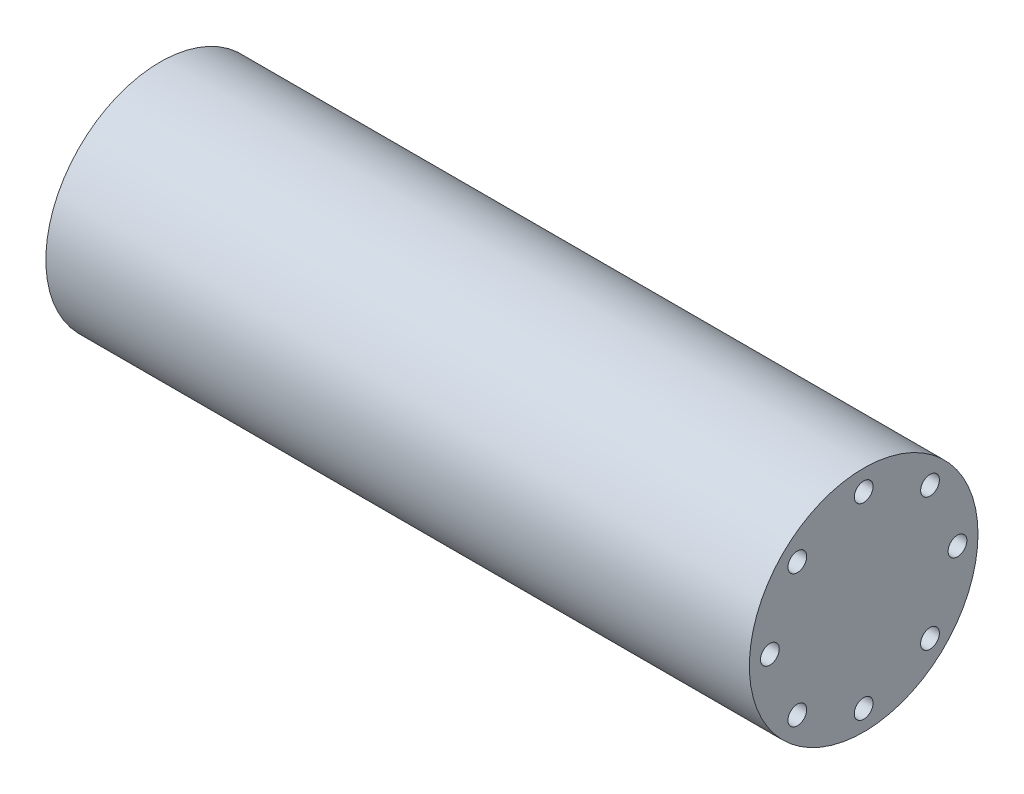
ISO-10303-21;
HEADER;
FILE_DESCRIPTION(('STEP AP214'),'2;1');
FILE_NAME('part.step','',(''),(''),'','','');
FILE_SCHEMA(('AUTOMOTIVE_DESIGN { 1 0 10303 214 1 1 1 1 }'));
ENDSEC;
DATA;
#1=APPLICATION_CONTEXT('core data for automotive mechanical design processes');
#2=APPLICATION_PROTOCOL_DEFINITION('international standard','automotive_design',2000,#1);
#3=PRODUCT_CONTEXT('',#1,'mechanical');
#4=PRODUCT('Part','Part','',(#3));
#5=PRODUCT_RELATED_PRODUCT_CATEGORY('part','',(#4));
#6=PRODUCT_DEFINITION_FORMATION('','',#4);
#7=PRODUCT_DEFINITION_CONTEXT('part definition',#1,'design');
#8=PRODUCT_DEFINITION('design','',#6,#7);
#9=PRODUCT_DEFINITION_SHAPE('','',#8);
#10=(LENGTH_UNIT() NAMED_UNIT(*) SI_UNIT(.MILLI.,.METRE.));
#11=(NAMED_UNIT(*) PLANE_ANGLE_UNIT() SI_UNIT($,.RADIAN.));
#12=(NAMED_UNIT(*) SI_UNIT($,.STERADIAN.) SOLID_ANGLE_UNIT());
#13=UNCERTAINTY_MEASURE_WITH_UNIT(LENGTH_MEASURE(1.E-05),#10,'distance_accuracy_value','');
#14=(GEOMETRIC_REPRESENTATION_CONTEXT(3) GLOBAL_UNCERTAINTY_ASSIGNED_CONTEXT((#13)) GLOBAL_UNIT_ASSIGNED_CONTEXT((#10,
#11,#12)) REPRESENTATION_CONTEXT('',''));
#15=CARTESIAN_POINT('',(0.,0.,0.));
#16=DIRECTION('',(0.,0.,1.));
#17=DIRECTION('',(1.,0.,0.));
#18=AXIS2_PLACEMENT_3D('',#15,#16,#17);
#19=CARTESIAN_POINT('',(60.,0.,0.));
#20=DIRECTION('',(-1.,0.,0.));
#21=DIRECTION('',(0.,0.,1.));
#22=AXIS2_PLACEMENT_3D('',#19,#20,#21);
#23=CYLINDRICAL_SURFACE('',#22,9.75);
#24=CARTESIAN_POINT('',(60.,0.,0.));
#25=DIRECTION('',(1.,0.,0.));
#26=DIRECTION('',(0.,0.,-1.));
#27=AXIS2_PLACEMENT_3D('',#24,#25,#26);
#28=CIRCLE('',#27,9.75);
#29=CARTESIAN_POINT('',(60.,0.,-9.75));
#30=VERTEX_POINT('',#29);
#31=EDGE_CURVE('E11',#30,#30,#28,.T.);
#32=ORIENTED_EDGE('',*,*,#31,.F.);
#33=EDGE_LOOP('',(#32));
#34=FACE_BOUND('',#33,.T.);
#35=CARTESIAN_POINT('',(0.,0.,0.));
#36=DIRECTION('',(1.,0.,0.));
#37=DIRECTION('',(0.,0.,-1.));
#38=AXIS2_PLACEMENT_3D('',#35,#36,#37);
#39=CIRCLE('',#38,9.75);
#40=CARTESIAN_POINT('',(0.,0.,-9.75));
#41=VERTEX_POINT('',#40);
#42=EDGE_CURVE('E48',#41,#41,#39,.T.);
#43=ORIENTED_EDGE('',*,*,#42,.T.);
#44=EDGE_LOOP('',(#43));
#45=FACE_BOUND('',#44,.T.);
#46=ADVANCED_FACE('F45',(#34,#45),#23,.T.);
#47=CARTESIAN_POINT('',(60.,0.,0.));
#48=DIRECTION('',(1.,0.,0.));
#49=DIRECTION('',(0.,0.,-1.));
#50=AXIS2_PLACEMENT_3D('',#47,#48,#49);
#51=PLANE('',#50);
#52=CARTESIAN_POINT('',(60.,8.,0.));
#53=DIRECTION('',(1.,0.,0.));
#54=DIRECTION('',(0.,0.,-1.));
#55=AXIS2_PLACEMENT_3D('',#52,#53,#54);
#56=CIRCLE('',#55,0.8);
#57=CARTESIAN_POINT('',(60.,8.,-0.8));
#58=VERTEX_POINT('',#57);
#59=EDGE_CURVE('E175',#58,#58,#56,.T.);
#60=ORIENTED_EDGE('',*,*,#59,.F.);
#61=EDGE_LOOP('',(#60));
#62=FACE_BOUND('',#61,.T.);
#63=CARTESIAN_POINT('',(60.,5.65685424949262,-5.65685424949248));
#64=DIRECTION('',(1.,0.,0.));
#65=DIRECTION('',(0.,0.,-1.));
#66=AXIS2_PLACEMENT_3D('',#63,#64,#65);
#67=CIRCLE('',#66,0.799999999999999);
#68=CARTESIAN_POINT('',(60.,5.65685424949262,-6.45685424949248));
#69=VERTEX_POINT('',#68);
#70=EDGE_CURVE('E183',#69,#69,#67,.T.);
#71=ORIENTED_EDGE('',*,*,#70,.F.);
#72=EDGE_LOOP('',(#71));
#73=FACE_BOUND('',#72,.T.);
#74=CARTESIAN_POINT('',(60.,3.4008079572553E-13,-8.00000000000034));
#75=DIRECTION('',(1.,0.,0.));
#76=DIRECTION('',(0.,0.,-1.));
#77=AXIS2_PLACEMENT_3D('',#74,#75,#76);
#78=CIRCLE('',#77,0.8);
#79=CARTESIAN_POINT('',(60.,3.4008079572553E-13,-8.80000000000034));
#80=VERTEX_POINT('',#79);
#81=EDGE_CURVE('E191',#80,#80,#78,.T.);
#82=ORIENTED_EDGE('',*,*,#81,.F.);
#83=EDGE_LOOP('',(#82));
#84=FACE_BOUND('',#83,.T.);
#85=CARTESIAN_POINT('',(60.,-5.65685424949214,-5.65685424949296));
#86=DIRECTION('',(1.,0.,0.));
#87=DIRECTION('',(0.,0.,-1.));
#88=AXIS2_PLACEMENT_3D('',#85,#86,#87);
#89=CIRCLE('',#88,0.799999999999999);
#90=CARTESIAN_POINT('',(60.,-5.65685424949214,-6.45685424949296));
#91=VERTEX_POINT('',#90);
#92=EDGE_CURVE('E199',#91,#91,#89,.T.);
#93=ORIENTED_EDGE('',*,*,#92,.F.);
#94=EDGE_LOOP('',(#93));
#95=FACE_BOUND('',#94,.T.);
#96=CARTESIAN_POINT('',(60.,-8.,-6.8016159145106E-13));
#97=DIRECTION('',(1.,0.,0.));
#98=DIRECTION('',(0.,0.,-1.));
#99=AXIS2_PLACEMENT_3D('',#96,#97,#98);
#100=CIRCLE('',#99,0.799999999999999);
#101=CARTESIAN_POINT('',(60.,-8.,-0.80000000000068));
#102=VERTEX_POINT('',#101);
#103=EDGE_CURVE('E207',#102,#102,#100,.T.);
#104=ORIENTED_EDGE('',*,*,#103,.F.);
#105=EDGE_LOOP('',(#104));
#106=FACE_BOUND('',#105,.T.);
#107=CARTESIAN_POINT('',(60.,-5.65685424949262,5.6568542494918));
#108=DIRECTION('',(1.,0.,0.));
#109=DIRECTION('',(0.,0.,-1.));
#110=AXIS2_PLACEMENT_3D('',#107,#108,#109);
#111=CIRCLE('',#110,0.799999999999999);
#112=CARTESIAN_POINT('',(60.,-5.65685424949262,4.8568542494918));
#113=VERTEX_POINT('',#112);
#114=EDGE_CURVE('E215',#113,#113,#111,.T.);
#115=ORIENTED_EDGE('',*,*,#114,.F.);
#116=EDGE_LOOP('',(#115));
#117=FACE_BOUND('',#116,.T.);
#118=CARTESIAN_POINT('',(60.,-3.41060513164848E-13,7.99999999999966));
#119=DIRECTION('',(1.,0.,0.));
#120=DIRECTION('',(0.,0.,-1.));
#121=AXIS2_PLACEMENT_3D('',#118,#119,#120);
#122=CIRCLE('',#121,0.8);
#123=CARTESIAN_POINT('',(60.,-3.41060513164848E-13,7.19999999999966));
#124=VERTEX_POINT('',#123);
#125=EDGE_CURVE('E223',#124,#124,#122,.T.);
#126=ORIENTED_EDGE('',*,*,#125,.F.);
#127=EDGE_LOOP('',(#126));
#128=FACE_BOUND('',#127,.T.);
#129=CARTESIAN_POINT('',(60.,5.65685424949214,5.65685424949228));
#130=DIRECTION('',(1.,0.,0.));
#131=DIRECTION('',(0.,0.,-1.));
#132=AXIS2_PLACEMENT_3D('',#129,#130,#131);
#133=CIRCLE('',#132,0.799999999999999);
#134=CARTESIAN_POINT('',(60.,5.65685424949214,4.85685424949228));
#135=VERTEX_POINT('',#134);
#136=EDGE_CURVE('E231',#135,#135,#133,.T.);
#137=ORIENTED_EDGE('',*,*,#136,.F.);
#138=EDGE_LOOP('',(#137));
#139=FACE_BOUND('',#138,.T.);
#140=ORIENTED_EDGE('',*,*,#31,.T.);
#141=EDGE_LOOP('',(#140));
#142=FACE_BOUND('',#141,.T.);
#143=ADVANCED_FACE('F248',(#62,#73,#84,#95,#106,#117,#128,#139,#142),#51,.T.);
#144=CARTESIAN_POINT('',(0.,0.,0.));
#145=DIRECTION('',(1.,0.,0.));
#146=DIRECTION('',(0.,0.,-1.));
#147=AXIS2_PLACEMENT_3D('',#144,#145,#146);
#148=PLANE('',#147);
#149=CARTESIAN_POINT('',(0.,8.,0.));
#150=DIRECTION('',(-1.,0.,0.));
#151=DIRECTION('',(0.,0.,1.));
#152=AXIS2_PLACEMENT_3D('',#149,#150,#151);
#153=CIRCLE('',#152,0.8);
#154=CARTESIAN_POINT('',(0.,8.,0.8));
#155=VERTEX_POINT('',#154);
#156=EDGE_CURVE('E114',#155,#155,#153,.T.);
#157=ORIENTED_EDGE('',*,*,#156,.F.);
#158=EDGE_LOOP('',(#157));
#159=FACE_BOUND('',#158,.T.);
#160=CARTESIAN_POINT('',(0.,5.65685424949262,-5.65685424949248));
#161=DIRECTION('',(-1.,0.,0.));
#162=DIRECTION('',(0.,0.,1.));
#163=AXIS2_PLACEMENT_3D('',#160,#161,#162);
#164=CIRCLE('',#163,0.799999999999999);
#165=CARTESIAN_POINT('',(0.,5.65685424949262,-4.85685424949248));
#166=VERTEX_POINT('',#165);
#167=EDGE_CURVE('E113',#166,#166,#164,.T.);
#168=ORIENTED_EDGE('',*,*,#167,.F.);
#169=EDGE_LOOP('',(#168));
#170=FACE_BOUND('',#169,.T.);
#171=CARTESIAN_POINT('',(0.,3.4008079572553E-13,-8.00000000000034));
#172=DIRECTION('',(-1.,0.,0.));
#173=DIRECTION('',(0.,0.,1.));
#174=AXIS2_PLACEMENT_3D('',#171,#172,#173);
#175=CIRCLE('',#174,0.8);
#176=CARTESIAN_POINT('',(0.,3.4008079572553E-13,-7.20000000000034));
#177=VERTEX_POINT('',#176);
#178=EDGE_CURVE('E127',#177,#177,#175,.T.);
#179=ORIENTED_EDGE('',*,*,#178,.F.);
#180=EDGE_LOOP('',(#179));
#181=FACE_BOUND('',#180,.T.);
#182=CARTESIAN_POINT('',(0.,-5.65685424949214,-5.65685424949296));
#183=DIRECTION('',(-1.,0.,0.));
#184=DIRECTION('',(0.,0.,1.));
#185=AXIS2_PLACEMENT_3D('',#182,#183,#184);
#186=CIRCLE('',#185,0.799999999999999);
#187=CARTESIAN_POINT('',(0.,-5.65685424949214,-4.85685424949296));
#188=VERTEX_POINT('',#187);
#189=EDGE_CURVE('E135',#188,#188,#186,.T.);
#190=ORIENTED_EDGE('',*,*,#189,.F.);
#191=EDGE_LOOP('',(#190));
#192=FACE_BOUND('',#191,.T.);
#193=CARTESIAN_POINT('',(0.,-8.,-6.8016159145106E-13));
#194=DIRECTION('',(-1.,0.,0.));
#195=DIRECTION('',(0.,0.,1.));
#196=AXIS2_PLACEMENT_3D('',#193,#194,#195);
#197=CIRCLE('',#196,0.799999999999999);
#198=CARTESIAN_POINT('',(0.,-8.,0.799999999999319));
#199=VERTEX_POINT('',#198);
#200=EDGE_CURVE('E143',#199,#199,#197,.T.);
#201=ORIENTED_EDGE('',*,*,#200,.F.);
#202=EDGE_LOOP('',(#201));
#203=FACE_BOUND('',#202,.T.);
#204=CARTESIAN_POINT('',(0.,-5.65685424949262,5.6568542494918));
#205=DIRECTION('',(-1.,0.,0.));
#206=DIRECTION('',(0.,0.,1.));
#207=AXIS2_PLACEMENT_3D('',#204,#205,#206);
#208=CIRCLE('',#207,0.799999999999999);
#209=CARTESIAN_POINT('',(0.,-5.65685424949262,6.4568542494918));
#210=VERTEX_POINT('',#209);
#211=EDGE_CURVE('E151',#210,#210,#208,.T.);
#212=ORIENTED_EDGE('',*,*,#211,.F.);
#213=EDGE_LOOP('',(#212));
#214=FACE_BOUND('',#213,.T.);
#215=CARTESIAN_POINT('',(0.,-3.41060513164848E-13,7.99999999999966));
#216=DIRECTION('',(-1.,0.,0.));
#217=DIRECTION('',(0.,0.,1.));
#218=AXIS2_PLACEMENT_3D('',#215,#216,#217);
#219=CIRCLE('',#218,0.8);
#220=CARTESIAN_POINT('',(0.,-3.41060513164848E-13,8.79999999999966));
#221=VERTEX_POINT('',#220);
#222=EDGE_CURVE('E159',#221,#221,#219,.T.);
#223=ORIENTED_EDGE('',*,*,#222,.F.);
#224=EDGE_LOOP('',(#223));
#225=FACE_BOUND('',#224,.T.);
#226=CARTESIAN_POINT('',(0.,5.65685424949214,5.65685424949228));
#227=DIRECTION('',(-1.,0.,0.));
#228=DIRECTION('',(0.,0.,1.));
#229=AXIS2_PLACEMENT_3D('',#226,#227,#228);
#230=CIRCLE('',#229,0.799999999999999);
#231=CARTESIAN_POINT('',(0.,5.65685424949214,6.45685424949228));
#232=VERTEX_POINT('',#231);
#233=EDGE_CURVE('E167',#232,#232,#230,.T.);
#234=ORIENTED_EDGE('',*,*,#233,.F.);
#235=EDGE_LOOP('',(#234));
#236=FACE_BOUND('',#235,.T.);
#237=ORIENTED_EDGE('',*,*,#42,.F.);
#238=EDGE_LOOP('',(#237));
#239=FACE_BOUND('',#238,.T.);
#240=ADVANCED_FACE('F245',(#159,#170,#181,#192,#203,#214,#225,#236,#239),#148,.F.);
#241=CARTESIAN_POINT('',(54.8,5.65685424949214,5.65685424949228));
#242=DIRECTION('',(1.,0.,0.));
#243=DIRECTION('',(0.,0.,-1.));
#244=AXIS2_PLACEMENT_3D('',#241,#242,#243);
#245=CONICAL_SURFACE('',#244,0.799999999999999,1.02974425867666);
#246=CARTESIAN_POINT('',(54.319311504778,5.65685424949214,5.65685424949228));
#247=VERTEX_POINT('',#246);
#248=VERTEX_LOOP('',#247);
#249=FACE_BOUND('',#248,.T.);
#250=CARTESIAN_POINT('',(54.8,5.65685424949214,5.65685424949228));
#251=DIRECTION('',(1.,0.,0.));
#252=DIRECTION('',(0.,0.,-1.));
#253=AXIS2_PLACEMENT_3D('',#250,#251,#252);
#254=CIRCLE('',#253,0.799999999999999);
#255=CARTESIAN_POINT('',(54.8,5.65685424949214,4.85685424949228));
#256=VERTEX_POINT('',#255);
#257=EDGE_CURVE('E235',#256,#256,#254,.T.);
#258=ORIENTED_EDGE('',*,*,#257,.T.);
#259=EDGE_LOOP('',(#258));
#260=FACE_BOUND('',#259,.T.);
#261=ADVANCED_FACE('F247',(#249,#260),#245,.F.);
#262=CARTESIAN_POINT('',(60.,5.65685424949214,5.65685424949228));
#263=DIRECTION('',(1.,0.,0.));
#264=DIRECTION('',(0.,0.,-1.));
#265=AXIS2_PLACEMENT_3D('',#262,#263,#264);
#266=CYLINDRICAL_SURFACE('',#265,0.799999999999999);
#267=ORIENTED_EDGE('',*,*,#257,.F.);
#268=EDGE_LOOP('',(#267));
#269=FACE_BOUND('',#268,.T.);
#270=ORIENTED_EDGE('',*,*,#136,.T.);
#271=EDGE_LOOP('',(#270));
#272=FACE_BOUND('',#271,.T.);
#273=ADVANCED_FACE('F254',(#269,#272),#266,.F.);
#274=CARTESIAN_POINT('',(54.8,-3.41060513164848E-13,7.99999999999966));
#275=DIRECTION('',(1.,0.,0.));
#276=DIRECTION('',(0.,0.,-1.));
#277=AXIS2_PLACEMENT_3D('',#274,#275,#276);
#278=CONICAL_SURFACE('',#277,0.799999999999999,1.02974425867666);
#279=CARTESIAN_POINT('',(54.319311504778,-3.42451880561373E-13,7.99999999999966));
#280=VERTEX_POINT('',#279);
#281=VERTEX_LOOP('',#280);
#282=FACE_BOUND('',#281,.T.);
#283=CARTESIAN_POINT('',(54.8,-3.41060513164848E-13,7.99999999999966));
#284=DIRECTION('',(1.,0.,0.));
#285=DIRECTION('',(0.,0.,-1.));
#286=AXIS2_PLACEMENT_3D('',#283,#284,#285);
#287=CIRCLE('',#286,0.799999999999999);
#288=CARTESIAN_POINT('',(54.8,-3.41060513164848E-13,7.19999999999966));
#289=VERTEX_POINT('',#288);
#290=EDGE_CURVE('E227',#289,#289,#287,.T.);
#291=ORIENTED_EDGE('',*,*,#290,.T.);
#292=EDGE_LOOP('',(#291));
#293=FACE_BOUND('',#292,.T.);
#294=ADVANCED_FACE('F286',(#282,#293),#278,.F.);
#295=CARTESIAN_POINT('',(60.,-3.41060513164848E-13,7.99999999999966));
#296=DIRECTION('',(1.,0.,0.));
#297=DIRECTION('',(0.,0.,-1.));
#298=AXIS2_PLACEMENT_3D('',#295,#296,#297);
#299=CYLINDRICAL_SURFACE('',#298,0.799999999999999);
#300=ORIENTED_EDGE('',*,*,#290,.F.);
#301=EDGE_LOOP('',(#300));
#302=FACE_BOUND('',#301,.T.);
#303=ORIENTED_EDGE('',*,*,#125,.T.);
#304=EDGE_LOOP('',(#303));
#305=FACE_BOUND('',#304,.T.);
#306=ADVANCED_FACE('F294',(#302,#305),#299,.F.);
#307=CARTESIAN_POINT('',(54.8,-5.65685424949262,5.6568542494918));
#308=DIRECTION('',(1.,0.,0.));
#309=DIRECTION('',(0.,0.,-1.));
#310=AXIS2_PLACEMENT_3D('',#307,#308,#309);
#311=CONICAL_SURFACE('',#310,0.799999999999999,1.02974425867666);
#312=CARTESIAN_POINT('',(54.319311504778,-5.65685424949262,5.6568542494918));
#313=VERTEX_POINT('',#312);
#314=VERTEX_LOOP('',#313);
#315=FACE_BOUND('',#314,.T.);
#316=CARTESIAN_POINT('',(54.8,-5.65685424949262,5.6568542494918));
#317=DIRECTION('',(1.,0.,0.));
#318=DIRECTION('',(0.,0.,-1.));
#319=AXIS2_PLACEMENT_3D('',#316,#317,#318);
#320=CIRCLE('',#319,0.799999999999999);
#321=CARTESIAN_POINT('',(54.8,-5.65685424949262,4.8568542494918));
#322=VERTEX_POINT('',#321);
#323=EDGE_CURVE('E219',#322,#322,#320,.T.);
#324=ORIENTED_EDGE('',*,*,#323,.T.);
#325=EDGE_LOOP('',(#324));
#326=FACE_BOUND('',#325,.T.);
#327=ADVANCED_FACE('F299',(#315,#326),#311,.F.);
#328=CARTESIAN_POINT('',(60.,-5.65685424949262,5.6568542494918));
#329=DIRECTION('',(1.,0.,0.));
#330=DIRECTION('',(0.,0.,-1.));
#331=AXIS2_PLACEMENT_3D('',#328,#329,#330);
#332=CYLINDRICAL_SURFACE('',#331,0.799999999999999);
#333=ORIENTED_EDGE('',*,*,#323,.F.);
#334=EDGE_LOOP('',(#333));
#335=FACE_BOUND('',#334,.T.);
#336=ORIENTED_EDGE('',*,*,#114,.T.);
#337=EDGE_LOOP('',(#336));
#338=FACE_BOUND('',#337,.T.);
#339=ADVANCED_FACE('F307',(#335,#338),#332,.F.);
#340=CARTESIAN_POINT('',(54.8,-8.,-6.8016159145106E-13));
#341=DIRECTION('',(1.,0.,0.));
#342=DIRECTION('',(0.,0.,-1.));
#343=AXIS2_PLACEMENT_3D('',#340,#341,#342);
#344=CONICAL_SURFACE('',#343,0.799999999999999,1.02974425867666);
#345=CARTESIAN_POINT('',(54.319311504778,-8.,-6.8016159145106E-13));
#346=VERTEX_POINT('',#345);
#347=VERTEX_LOOP('',#346);
#348=FACE_BOUND('',#347,.T.);
#349=CARTESIAN_POINT('',(54.8,-8.,-6.8016159145106E-13));
#350=DIRECTION('',(1.,0.,0.));
#351=DIRECTION('',(0.,0.,-1.));
#352=AXIS2_PLACEMENT_3D('',#349,#350,#351);
#353=CIRCLE('',#352,0.799999999999999);
#354=CARTESIAN_POINT('',(54.8,-8.,-0.800000000000679));
#355=VERTEX_POINT('',#354);
#356=EDGE_CURVE('E211',#355,#355,#353,.T.);
#357=ORIENTED_EDGE('',*,*,#356,.T.);
#358=EDGE_LOOP('',(#357));
#359=FACE_BOUND('',#358,.T.);
#360=ADVANCED_FACE('F312',(#348,#359),#344,.F.);
#361=CARTESIAN_POINT('',(60.,-8.,-6.8016159145106E-13));
#362=DIRECTION('',(1.,0.,0.));
#363=DIRECTION('',(0.,0.,-1.));
#364=AXIS2_PLACEMENT_3D('',#361,#362,#363);
#365=CYLINDRICAL_SURFACE('',#364,0.799999999999999);
#366=ORIENTED_EDGE('',*,*,#356,.F.);
#367=EDGE_LOOP('',(#366));
#368=FACE_BOUND('',#367,.T.);
#369=ORIENTED_EDGE('',*,*,#103,.T.);
#370=EDGE_LOOP('',(#369));
#371=FACE_BOUND('',#370,.T.);
#372=ADVANCED_FACE('F320',(#368,#371),#365,.F.);
#373=CARTESIAN_POINT('',(54.8,-5.65685424949214,-5.65685424949296));
#374=DIRECTION('',(1.,0.,0.));
#375=DIRECTION('',(0.,0.,-1.));
#376=AXIS2_PLACEMENT_3D('',#373,#374,#375);
#377=CONICAL_SURFACE('',#376,0.799999999999999,1.02974425867666);
#378=CARTESIAN_POINT('',(54.319311504778,-5.65685424949214,-5.65685424949296));
#379=VERTEX_POINT('',#378);
#380=VERTEX_LOOP('',#379);
#381=FACE_BOUND('',#380,.T.);
#382=CARTESIAN_POINT('',(54.8,-5.65685424949214,-5.65685424949296));
#383=DIRECTION('',(1.,0.,0.));
#384=DIRECTION('',(0.,0.,-1.));
#385=AXIS2_PLACEMENT_3D('',#382,#383,#384);
#386=CIRCLE('',#385,0.799999999999999);
#387=CARTESIAN_POINT('',(54.8,-5.65685424949214,-6.45685424949296));
#388=VERTEX_POINT('',#387);
#389=EDGE_CURVE('E203',#388,#388,#386,.T.);
#390=ORIENTED_EDGE('',*,*,#389,.T.);
#391=EDGE_LOOP('',(#390));
#392=FACE_BOUND('',#391,.T.);
#393=ADVANCED_FACE('F325',(#381,#392),#377,.F.);
#394=CARTESIAN_POINT('',(60.,-5.65685424949214,-5.65685424949296));
#395=DIRECTION('',(1.,0.,0.));
#396=DIRECTION('',(0.,0.,-1.));
#397=AXIS2_PLACEMENT_3D('',#394,#395,#396);
#398=CYLINDRICAL_SURFACE('',#397,0.799999999999999);
#399=ORIENTED_EDGE('',*,*,#389,.F.);
#400=EDGE_LOOP('',(#399));
#401=FACE_BOUND('',#400,.T.);
#402=ORIENTED_EDGE('',*,*,#92,.T.);
#403=EDGE_LOOP('',(#402));
#404=FACE_BOUND('',#403,.T.);
#405=ADVANCED_FACE('F333',(#401,#404),#398,.F.);
#406=CARTESIAN_POINT('',(54.8,3.4008079572553E-13,-8.00000000000034));
#407=DIRECTION('',(1.,0.,0.));
#408=DIRECTION('',(0.,0.,-1.));
#409=AXIS2_PLACEMENT_3D('',#406,#407,#408);
#410=CONICAL_SURFACE('',#409,0.799999999999999,1.02974425867666);
#411=CARTESIAN_POINT('',(54.319311504778,3.38689428329005E-13,-8.00000000000034));
#412=VERTEX_POINT('',#411);
#413=VERTEX_LOOP('',#412);
#414=FACE_BOUND('',#413,.T.);
#415=CARTESIAN_POINT('',(54.8,3.4008079572553E-13,-8.00000000000034));
#416=DIRECTION('',(1.,0.,0.));
#417=DIRECTION('',(0.,0.,-1.));
#418=AXIS2_PLACEMENT_3D('',#415,#416,#417);
#419=CIRCLE('',#418,0.799999999999999);
#420=CARTESIAN_POINT('',(54.8,3.4008079572553E-13,-8.80000000000034));
#421=VERTEX_POINT('',#420);
#422=EDGE_CURVE('E195',#421,#421,#419,.T.);
#423=ORIENTED_EDGE('',*,*,#422,.T.);
#424=EDGE_LOOP('',(#423));
#425=FACE_BOUND('',#424,.T.);
#426=ADVANCED_FACE('F338',(#414,#425),#410,.F.);
#427=CARTESIAN_POINT('',(60.,3.4008079572553E-13,-8.00000000000034));
#428=DIRECTION('',(1.,0.,0.));
#429=DIRECTION('',(0.,0.,-1.));
#430=AXIS2_PLACEMENT_3D('',#427,#428,#429);
#431=CYLINDRICAL_SURFACE('',#430,0.799999999999999);
#432=ORIENTED_EDGE('',*,*,#422,.F.);
#433=EDGE_LOOP('',(#432));
#434=FACE_BOUND('',#433,.T.);
#435=ORIENTED_EDGE('',*,*,#81,.T.);
#436=EDGE_LOOP('',(#435));
#437=FACE_BOUND('',#436,.T.);
#438=ADVANCED_FACE('F346',(#434,#437),#431,.F.);
#439=CARTESIAN_POINT('',(54.8,5.65685424949262,-5.65685424949248));
#440=DIRECTION('',(1.,0.,0.));
#441=DIRECTION('',(0.,0.,-1.));
#442=AXIS2_PLACEMENT_3D('',#439,#440,#441);
#443=CONICAL_SURFACE('',#442,0.799999999999999,1.02974425867666);
#444=CARTESIAN_POINT('',(54.319311504778,5.65685424949262,-5.65685424949248));
#445=VERTEX_POINT('',#444);
#446=VERTEX_LOOP('',#445);
#447=FACE_BOUND('',#446,.T.);
#448=CARTESIAN_POINT('',(54.8,5.65685424949262,-5.65685424949248));
#449=DIRECTION('',(1.,0.,0.));
#450=DIRECTION('',(0.,0.,-1.));
#451=AXIS2_PLACEMENT_3D('',#448,#449,#450);
#452=CIRCLE('',#451,0.799999999999999);
#453=CARTESIAN_POINT('',(54.8,5.65685424949262,-6.45685424949248));
#454=VERTEX_POINT('',#453);
#455=EDGE_CURVE('E187',#454,#454,#452,.T.);
#456=ORIENTED_EDGE('',*,*,#455,.T.);
#457=EDGE_LOOP('',(#456));
#458=FACE_BOUND('',#457,.T.);
#459=ADVANCED_FACE('F351',(#447,#458),#443,.F.);
#460=CARTESIAN_POINT('',(60.,5.65685424949262,-5.65685424949248));
#461=DIRECTION('',(1.,0.,0.));
#462=DIRECTION('',(0.,0.,-1.));
#463=AXIS2_PLACEMENT_3D('',#460,#461,#462);
#464=CYLINDRICAL_SURFACE('',#463,0.799999999999999);
#465=ORIENTED_EDGE('',*,*,#455,.F.);
#466=EDGE_LOOP('',(#465));
#467=FACE_BOUND('',#466,.T.);
#468=ORIENTED_EDGE('',*,*,#70,.T.);
#469=EDGE_LOOP('',(#468));
#470=FACE_BOUND('',#469,.T.);
#471=ADVANCED_FACE('F358',(#467,#470),#464,.F.);
#472=CARTESIAN_POINT('',(54.8,8.,0.));
#473=DIRECTION('',(1.,0.,0.));
#474=DIRECTION('',(0.,0.,-1.));
#475=AXIS2_PLACEMENT_3D('',#472,#473,#474);
#476=CONICAL_SURFACE('',#475,0.799999999999999,1.02974425867666);
#477=CARTESIAN_POINT('',(54.319311504778,8.,0.));
#478=VERTEX_POINT('',#477);
#479=VERTEX_LOOP('',#478);
#480=FACE_BOUND('',#479,.T.);
#481=CARTESIAN_POINT('',(54.8,8.,0.));
#482=DIRECTION('',(1.,0.,0.));
#483=DIRECTION('',(0.,0.,-1.));
#484=AXIS2_PLACEMENT_3D('',#481,#482,#483);
#485=CIRCLE('',#484,0.799999999999999);
#486=CARTESIAN_POINT('',(54.8,8.,-0.799999999999999));
#487=VERTEX_POINT('',#486);
#488=EDGE_CURVE('E179',#487,#487,#485,.T.);
#489=ORIENTED_EDGE('',*,*,#488,.T.);
#490=EDGE_LOOP('',(#489));
#491=FACE_BOUND('',#490,.T.);
#492=ADVANCED_FACE('F361',(#480,#491),#476,.F.);
#493=CARTESIAN_POINT('',(60.,8.,0.));
#494=DIRECTION('',(1.,0.,0.));
#495=DIRECTION('',(0.,0.,-1.));
#496=AXIS2_PLACEMENT_3D('',#493,#494,#495);
#497=CYLINDRICAL_SURFACE('',#496,0.799999999999999);
#498=ORIENTED_EDGE('',*,*,#488,.F.);
#499=EDGE_LOOP('',(#498));
#500=FACE_BOUND('',#499,.T.);
#501=ORIENTED_EDGE('',*,*,#59,.T.);
#502=EDGE_LOOP('',(#501));
#503=FACE_BOUND('',#502,.T.);
#504=ADVANCED_FACE('F278',(#500,#503),#497,.F.);
#505=CARTESIAN_POINT('',(5.2,5.65685424949214,5.65685424949228));
#506=DIRECTION('',(-1.,0.,0.));
#507=DIRECTION('',(0.,0.,1.));
#508=AXIS2_PLACEMENT_3D('',#505,#506,#507);
#509=CONICAL_SURFACE('',#508,0.799999999999999,1.02974425867665);
#510=CARTESIAN_POINT('',(5.68068849522205,5.65685424949214,5.65685424949228));
#511=VERTEX_POINT('',#510);
#512=VERTEX_LOOP('',#511);
#513=FACE_BOUND('',#512,.T.);
#514=CARTESIAN_POINT('',(5.2,5.65685424949214,5.65685424949228));
#515=DIRECTION('',(-1.,0.,0.));
#516=DIRECTION('',(0.,0.,1.));
#517=AXIS2_PLACEMENT_3D('',#514,#515,#516);
#518=CIRCLE('',#517,0.799999999999999);
#519=CARTESIAN_POINT('',(5.2,5.65685424949214,6.45685424949228));
#520=VERTEX_POINT('',#519);
#521=EDGE_CURVE('E171',#520,#520,#518,.T.);
#522=ORIENTED_EDGE('',*,*,#521,.T.);
#523=EDGE_LOOP('',(#522));
#524=FACE_BOUND('',#523,.T.);
#525=ADVANCED_FACE('F371',(#513,#524),#509,.F.);
#526=CARTESIAN_POINT('',(0.,5.65685424949214,5.65685424949228));
#527=DIRECTION('',(-1.,0.,0.));
#528=DIRECTION('',(0.,0.,1.));
#529=AXIS2_PLACEMENT_3D('',#526,#527,#528);
#530=CYLINDRICAL_SURFACE('',#529,0.799999999999999);
#531=ORIENTED_EDGE('',*,*,#521,.F.);
#532=EDGE_LOOP('',(#531));
#533=FACE_BOUND('',#532,.T.);
#534=ORIENTED_EDGE('',*,*,#233,.T.);
#535=EDGE_LOOP('',(#534));
#536=FACE_BOUND('',#535,.T.);
#537=ADVANCED_FACE('F459',(#533,#536),#530,.F.);
#538=CARTESIAN_POINT('',(5.2,-3.41060513164848E-13,7.99999999999966));
#539=DIRECTION('',(-1.,0.,0.));
#540=DIRECTION('',(0.,0.,1.));
#541=AXIS2_PLACEMENT_3D('',#538,#539,#540);
#542=CONICAL_SURFACE('',#541,0.799999999999999,1.02974425867665);
#543=CARTESIAN_POINT('',(5.68068849522205,-3.42451880561373E-13,7.99999999999966));
#544=VERTEX_POINT('',#543);
#545=VERTEX_LOOP('',#544);
#546=FACE_BOUND('',#545,.T.);
#547=CARTESIAN_POINT('',(5.2,-3.41060513164848E-13,7.99999999999966));
#548=DIRECTION('',(-1.,0.,0.));
#549=DIRECTION('',(0.,0.,1.));
#550=AXIS2_PLACEMENT_3D('',#547,#548,#549);
#551=CIRCLE('',#550,0.799999999999999);
#552=CARTESIAN_POINT('',(5.2,-3.41060513164848E-13,8.79999999999966));
#553=VERTEX_POINT('',#552);
#554=EDGE_CURVE('E163',#553,#553,#551,.T.);
#555=ORIENTED_EDGE('',*,*,#554,.T.);
#556=EDGE_LOOP('',(#555));
#557=FACE_BOUND('',#556,.T.);
#558=ADVANCED_FACE('F451',(#546,#557),#542,.F.);
#559=CARTESIAN_POINT('',(0.,-3.41060513164848E-13,7.99999999999966));
#560=DIRECTION('',(-1.,0.,0.));
#561=DIRECTION('',(0.,0.,1.));
#562=AXIS2_PLACEMENT_3D('',#559,#560,#561);
#563=CYLINDRICAL_SURFACE('',#562,0.799999999999999);
#564=ORIENTED_EDGE('',*,*,#554,.F.);
#565=EDGE_LOOP('',(#564));
#566=FACE_BOUND('',#565,.T.);
#567=ORIENTED_EDGE('',*,*,#222,.T.);
#568=EDGE_LOOP('',(#567));
#569=FACE_BOUND('',#568,.T.);
#570=ADVANCED_FACE('F446',(#566,#569),#563,.F.);
#571=CARTESIAN_POINT('',(5.2,-5.65685424949262,5.6568542494918));
#572=DIRECTION('',(-1.,0.,0.));
#573=DIRECTION('',(0.,0.,1.));
#574=AXIS2_PLACEMENT_3D('',#571,#572,#573);
#575=CONICAL_SURFACE('',#574,0.799999999999999,1.02974425867665);
#576=CARTESIAN_POINT('',(5.68068849522205,-5.65685424949262,5.6568542494918));
#577=VERTEX_POINT('',#576);
#578=VERTEX_LOOP('',#577);
#579=FACE_BOUND('',#578,.T.);
#580=CARTESIAN_POINT('',(5.2,-5.65685424949262,5.6568542494918));
#581=DIRECTION('',(-1.,0.,0.));
#582=DIRECTION('',(0.,0.,1.));
#583=AXIS2_PLACEMENT_3D('',#580,#581,#582);
#584=CIRCLE('',#583,0.799999999999999);
#585=CARTESIAN_POINT('',(5.2,-5.65685424949262,6.4568542494918));
#586=VERTEX_POINT('',#585);
#587=EDGE_CURVE('E155',#586,#586,#584,.T.);
#588=ORIENTED_EDGE('',*,*,#587,.T.);
#589=EDGE_LOOP('',(#588));
#590=FACE_BOUND('',#589,.T.);
#591=ADVANCED_FACE('F439',(#579,#590),#575,.F.);
#592=CARTESIAN_POINT('',(0.,-5.65685424949262,5.6568542494918));
#593=DIRECTION('',(-1.,0.,0.));
#594=DIRECTION('',(0.,0.,1.));
#595=AXIS2_PLACEMENT_3D('',#592,#593,#594);
#596=CYLINDRICAL_SURFACE('',#595,0.799999999999999);
#597=ORIENTED_EDGE('',*,*,#587,.F.);
#598=EDGE_LOOP('',(#597));
#599=FACE_BOUND('',#598,.T.);
#600=ORIENTED_EDGE('',*,*,#211,.T.);
#601=EDGE_LOOP('',(#600));
#602=FACE_BOUND('',#601,.T.);
#603=ADVANCED_FACE('F435',(#599,#602),#596,.F.);
#604=CARTESIAN_POINT('',(5.2,-8.,-6.8016159145106E-13));
#605=DIRECTION('',(-1.,0.,0.));
#606=DIRECTION('',(0.,0.,1.));
#607=AXIS2_PLACEMENT_3D('',#604,#605,#606);
#608=CONICAL_SURFACE('',#607,0.799999999999999,1.02974425867665);
#609=CARTESIAN_POINT('',(5.68068849522205,-8.,-6.8016159145106E-13));
#610=VERTEX_POINT('',#609);
#611=VERTEX_LOOP('',#610);
#612=FACE_BOUND('',#611,.T.);
#613=CARTESIAN_POINT('',(5.2,-8.,-6.8016159145106E-13));
#614=DIRECTION('',(-1.,0.,0.));
#615=DIRECTION('',(0.,0.,1.));
#616=AXIS2_PLACEMENT_3D('',#613,#614,#615);
#617=CIRCLE('',#616,0.799999999999999);
#618=CARTESIAN_POINT('',(5.2,-8.,0.799999999999318));
#619=VERTEX_POINT('',#618);
#620=EDGE_CURVE('E147',#619,#619,#617,.T.);
#621=ORIENTED_EDGE('',*,*,#620,.T.);
#622=EDGE_LOOP('',(#621));
#623=FACE_BOUND('',#622,.T.);
#624=ADVANCED_FACE('F427',(#612,#623),#608,.F.);
#625=CARTESIAN_POINT('',(0.,-8.,-6.8016159145106E-13));
#626=DIRECTION('',(-1.,0.,0.));
#627=DIRECTION('',(0.,0.,1.));
#628=AXIS2_PLACEMENT_3D('',#625,#626,#627);
#629=CYLINDRICAL_SURFACE('',#628,0.799999999999999);
#630=ORIENTED_EDGE('',*,*,#620,.F.);
#631=EDGE_LOOP('',(#630));
#632=FACE_BOUND('',#631,.T.);
#633=ORIENTED_EDGE('',*,*,#200,.T.);
#634=EDGE_LOOP('',(#633));
#635=FACE_BOUND('',#634,.T.);
#636=ADVANCED_FACE('F422',(#632,#635),#629,.F.);
#637=CARTESIAN_POINT('',(5.2,-5.65685424949214,-5.65685424949296));
#638=DIRECTION('',(-1.,0.,0.));
#639=DIRECTION('',(0.,0.,1.));
#640=AXIS2_PLACEMENT_3D('',#637,#638,#639);
#641=CONICAL_SURFACE('',#640,0.799999999999999,1.02974425867665);
#642=CARTESIAN_POINT('',(5.68068849522205,-5.65685424949214,-5.65685424949296));
#643=VERTEX_POINT('',#642);
#644=VERTEX_LOOP('',#643);
#645=FACE_BOUND('',#644,.T.);
#646=CARTESIAN_POINT('',(5.2,-5.65685424949214,-5.65685424949296));
#647=DIRECTION('',(-1.,0.,0.));
#648=DIRECTION('',(0.,0.,1.));
#649=AXIS2_PLACEMENT_3D('',#646,#647,#648);
#650=CIRCLE('',#649,0.799999999999999);
#651=CARTESIAN_POINT('',(5.2,-5.65685424949214,-4.85685424949296));
#652=VERTEX_POINT('',#651);
#653=EDGE_CURVE('E139',#652,#652,#650,.T.);
#654=ORIENTED_EDGE('',*,*,#653,.T.);
#655=EDGE_LOOP('',(#654));
#656=FACE_BOUND('',#655,.T.);
#657=ADVANCED_FACE('F415',(#645,#656),#641,.F.);
#658=CARTESIAN_POINT('',(0.,-5.65685424949214,-5.65685424949296));
#659=DIRECTION('',(-1.,0.,0.));
#660=DIRECTION('',(0.,0.,1.));
#661=AXIS2_PLACEMENT_3D('',#658,#659,#660);
#662=CYLINDRICAL_SURFACE('',#661,0.799999999999999);
#663=ORIENTED_EDGE('',*,*,#653,.F.);
#664=EDGE_LOOP('',(#663));
#665=FACE_BOUND('',#664,.T.);
#666=ORIENTED_EDGE('',*,*,#189,.T.);
#667=EDGE_LOOP('',(#666));
#668=FACE_BOUND('',#667,.T.);
#669=ADVANCED_FACE('F410',(#665,#668),#662,.F.);
#670=CARTESIAN_POINT('',(5.2,3.4008079572553E-13,-8.00000000000034));
#671=DIRECTION('',(-1.,0.,0.));
#672=DIRECTION('',(0.,0.,1.));
#673=AXIS2_PLACEMENT_3D('',#670,#671,#672);
#674=CONICAL_SURFACE('',#673,0.799999999999999,1.02974425867665);
#675=CARTESIAN_POINT('',(5.68068849522205,3.38689428329005E-13,-8.00000000000034));
#676=VERTEX_POINT('',#675);
#677=VERTEX_LOOP('',#676);
#678=FACE_BOUND('',#677,.T.);
#679=CARTESIAN_POINT('',(5.2,3.4008079572553E-13,-8.00000000000034));
#680=DIRECTION('',(-1.,0.,0.));
#681=DIRECTION('',(0.,0.,1.));
#682=AXIS2_PLACEMENT_3D('',#679,#680,#681);
#683=CIRCLE('',#682,0.799999999999999);
#684=CARTESIAN_POINT('',(5.2,3.4008079572553E-13,-7.20000000000034));
#685=VERTEX_POINT('',#684);
#686=EDGE_CURVE('E131',#685,#685,#683,.T.);
#687=ORIENTED_EDGE('',*,*,#686,.T.);
#688=EDGE_LOOP('',(#687));
#689=FACE_BOUND('',#688,.T.);
#690=ADVANCED_FACE('F393',(#678,#689),#674,.F.);
#691=CARTESIAN_POINT('',(0.,3.4008079572553E-13,-8.00000000000034));
#692=DIRECTION('',(-1.,0.,0.));
#693=DIRECTION('',(0.,0.,1.));
#694=AXIS2_PLACEMENT_3D('',#691,#692,#693);
#695=CYLINDRICAL_SURFACE('',#694,0.799999999999999);
#696=ORIENTED_EDGE('',*,*,#686,.F.);
#697=EDGE_LOOP('',(#696));
#698=FACE_BOUND('',#697,.T.);
#699=ORIENTED_EDGE('',*,*,#178,.T.);
#700=EDGE_LOOP('',(#699));
#701=FACE_BOUND('',#700,.T.);
#702=ADVANCED_FACE('F387',(#698,#701),#695,.F.);
#703=CARTESIAN_POINT('',(5.2,5.65685424949262,-5.65685424949248));
#704=DIRECTION('',(-1.,0.,0.));
#705=DIRECTION('',(0.,0.,1.));
#706=AXIS2_PLACEMENT_3D('',#703,#704,#705);
#707=CONICAL_SURFACE('',#706,0.799999999999999,1.02974425867665);
#708=CARTESIAN_POINT('',(5.68068849522205,5.65685424949262,-5.65685424949248));
#709=VERTEX_POINT('',#708);
#710=VERTEX_LOOP('',#709);
#711=FACE_BOUND('',#710,.T.);
#712=CARTESIAN_POINT('',(5.2,5.65685424949262,-5.65685424949248));
#713=DIRECTION('',(-1.,0.,0.));
#714=DIRECTION('',(0.,0.,1.));
#715=AXIS2_PLACEMENT_3D('',#712,#713,#714);
#716=CIRCLE('',#715,0.799999999999999);
#717=CARTESIAN_POINT('',(5.2,5.65685424949262,-4.85685424949248));
#718=VERTEX_POINT('',#717);
#719=EDGE_CURVE('E119',#718,#718,#716,.T.);
#720=ORIENTED_EDGE('',*,*,#719,.T.);
#721=EDGE_LOOP('',(#720));
#722=FACE_BOUND('',#721,.T.);
#723=ADVANCED_FACE('F392',(#711,#722),#707,.F.);
#724=CARTESIAN_POINT('',(0.,5.65685424949262,-5.65685424949248));
#725=DIRECTION('',(-1.,0.,0.));
#726=DIRECTION('',(0.,0.,1.));
#727=AXIS2_PLACEMENT_3D('',#724,#725,#726);
#728=CYLINDRICAL_SURFACE('',#727,0.799999999999999);
#729=ORIENTED_EDGE('',*,*,#719,.F.);
#730=EDGE_LOOP('',(#729));
#731=FACE_BOUND('',#730,.T.);
#732=ORIENTED_EDGE('',*,*,#167,.T.);
#733=EDGE_LOOP('',(#732));
#734=FACE_BOUND('',#733,.T.);
#735=ADVANCED_FACE('F106',(#731,#734),#728,.F.);
#736=CARTESIAN_POINT('',(5.2,8.,0.));
#737=DIRECTION('',(-1.,0.,0.));
#738=DIRECTION('',(0.,0.,1.));
#739=AXIS2_PLACEMENT_3D('',#736,#737,#738);
#740=CONICAL_SURFACE('',#739,0.799999999999999,1.02974425867665);
#741=CARTESIAN_POINT('',(5.68068849522205,8.,0.));
#742=VERTEX_POINT('',#741);
#743=VERTEX_LOOP('',#742);
#744=FACE_BOUND('',#743,.T.);
#745=CARTESIAN_POINT('',(5.2,8.,0.));
#746=DIRECTION('',(-1.,0.,0.));
#747=DIRECTION('',(0.,0.,1.));
#748=AXIS2_PLACEMENT_3D('',#745,#746,#747);
#749=CIRCLE('',#748,0.799999999999999);
#750=CARTESIAN_POINT('',(5.2,8.,0.799999999999999));
#751=VERTEX_POINT('',#750);
#752=EDGE_CURVE('E110',#751,#751,#749,.T.);
#753=ORIENTED_EDGE('',*,*,#752,.T.);
#754=EDGE_LOOP('',(#753));
#755=FACE_BOUND('',#754,.T.);
#756=ADVANCED_FACE('F102',(#744,#755),#740,.F.);
#757=CARTESIAN_POINT('',(0.,8.,0.));
#758=DIRECTION('',(-1.,0.,0.));
#759=DIRECTION('',(0.,0.,1.));
#760=AXIS2_PLACEMENT_3D('',#757,#758,#759);
#761=CYLINDRICAL_SURFACE('',#760,0.799999999999999);
#762=ORIENTED_EDGE('',*,*,#752,.F.);
#763=EDGE_LOOP('',(#762));
#764=FACE_BOUND('',#763,.T.);
#765=ORIENTED_EDGE('',*,*,#156,.T.);
#766=EDGE_LOOP('',(#765));
#767=FACE_BOUND('',#766,.T.);
#768=ADVANCED_FACE('F105',(#764,#767),#761,.F.);
#769=CLOSED_SHELL('',(#46,#143,#240,#261,#273,#294,#306,#327,#339,#360,#372,#393,#405,#426,#438,
#459,#471,#492,#504,#525,#537,#558,#570,#591,#603,#624,#636,#657,#669,#690,#702,#723,#735,#756,#768));
#770=MANIFOLD_SOLID_BREP('B2',#769);
#771=ADVANCED_BREP_SHAPE_REPRESENTATION('',(#18,#770),#14);
#772=SHAPE_DEFINITION_REPRESENTATION(#9,#771);
ENDSEC;
END-ISO-10303-21;
